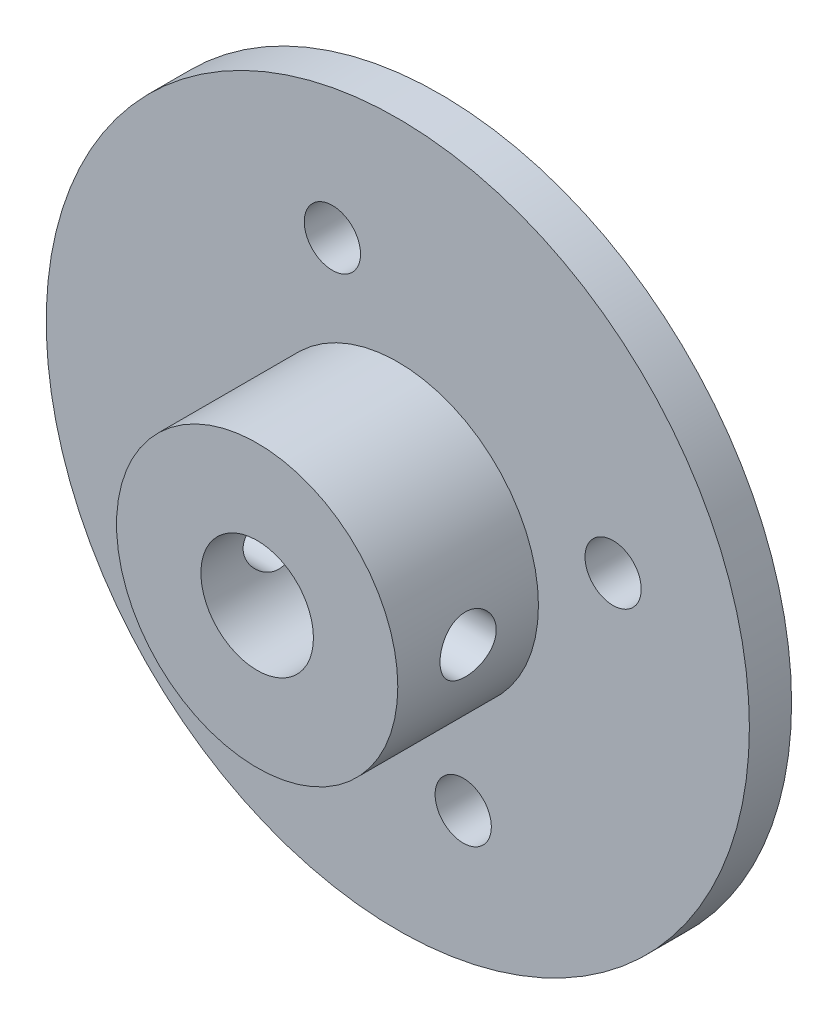
ISO-10303-21;
HEADER;
FILE_DESCRIPTION(('STEP AP214'),'2;1');
FILE_NAME('part.step','',(''),(''),'','','');
FILE_SCHEMA(('AUTOMOTIVE_DESIGN { 1 0 10303 214 1 1 1 1 }'));
ENDSEC;
DATA;
#1=APPLICATION_CONTEXT('core data for automotive mechanical design processes');
#2=APPLICATION_PROTOCOL_DEFINITION('international standard','automotive_design',2000,#1);
#3=PRODUCT_CONTEXT('',#1,'mechanical');
#4=PRODUCT('Part','Part','',(#3));
#5=PRODUCT_RELATED_PRODUCT_CATEGORY('part','',(#4));
#6=PRODUCT_DEFINITION_FORMATION('','',#4);
#7=PRODUCT_DEFINITION_CONTEXT('part definition',#1,'design');
#8=PRODUCT_DEFINITION('design','',#6,#7);
#9=PRODUCT_DEFINITION_SHAPE('','',#8);
#10=(LENGTH_UNIT() NAMED_UNIT(*) SI_UNIT(.MILLI.,.METRE.));
#11=(NAMED_UNIT(*) PLANE_ANGLE_UNIT() SI_UNIT($,.RADIAN.));
#12=(NAMED_UNIT(*) SI_UNIT($,.STERADIAN.) SOLID_ANGLE_UNIT());
#13=UNCERTAINTY_MEASURE_WITH_UNIT(LENGTH_MEASURE(1.E-05),#10,'distance_accuracy_value','');
#14=(GEOMETRIC_REPRESENTATION_CONTEXT(3) GLOBAL_UNCERTAINTY_ASSIGNED_CONTEXT((#13)) GLOBAL_UNIT_ASSIGNED_CONTEXT((#10,
#11,#12)) REPRESENTATION_CONTEXT('',''));
#15=CARTESIAN_POINT('',(0.,0.,0.));
#16=DIRECTION('',(0.,0.,1.));
#17=DIRECTION('',(1.,0.,0.));
#18=AXIS2_PLACEMENT_3D('',#15,#16,#17);
#19=CARTESIAN_POINT('',(0.,0.,3.));
#20=DIRECTION('',(0.,0.,-1.));
#21=DIRECTION('',(-1.,0.,0.));
#22=AXIS2_PLACEMENT_3D('',#19,#20,#21);
#23=CYLINDRICAL_SURFACE('',#22,25.);
#24=CARTESIAN_POINT('',(0.,0.,3.));
#25=DIRECTION('',(0.,0.,1.));
#26=DIRECTION('',(1.,0.,0.));
#27=AXIS2_PLACEMENT_3D('',#24,#25,#26);
#28=CIRCLE('',#27,25.);
#29=CARTESIAN_POINT('',(25.,0.,3.));
#30=VERTEX_POINT('',#29);
#31=EDGE_CURVE('E52',#30,#30,#28,.T.);
#32=ORIENTED_EDGE('',*,*,#31,.F.);
#33=EDGE_LOOP('',(#32));
#34=FACE_BOUND('',#33,.T.);
#35=CARTESIAN_POINT('',(0.,0.,0.));
#36=DIRECTION('',(0.,0.,1.));
#37=DIRECTION('',(1.,0.,0.));
#38=AXIS2_PLACEMENT_3D('',#35,#36,#37);
#39=CIRCLE('',#38,25.);
#40=CARTESIAN_POINT('',(25.,0.,0.));
#41=VERTEX_POINT('',#40);
#42=EDGE_CURVE('E58',#41,#41,#39,.T.);
#43=ORIENTED_EDGE('',*,*,#42,.T.);
#44=EDGE_LOOP('',(#43));
#45=FACE_BOUND('',#44,.T.);
#46=ADVANCED_FACE('F39',(#34,#45),#23,.T.);
#47=CARTESIAN_POINT('',(0.,0.,3.));
#48=DIRECTION('',(0.,0.,1.));
#49=DIRECTION('',(1.,0.,0.));
#50=AXIS2_PLACEMENT_3D('',#47,#48,#49);
#51=PLANE('',#50);
#52=CARTESIAN_POINT('',(-4.65167860969372,15.3088825886189,3.));
#53=DIRECTION('',(0.,0.,1.));
#54=DIRECTION('',(1.,0.,0.));
#55=AXIS2_PLACEMENT_3D('',#52,#53,#54);
#56=CIRCLE('',#55,2.);
#57=CARTESIAN_POINT('',(-2.65167860969372,15.3088825886189,3.));
#58=VERTEX_POINT('',#57);
#59=EDGE_CURVE('E278',#58,#58,#56,.T.);
#60=ORIENTED_EDGE('',*,*,#59,.F.);
#61=EDGE_LOOP('',(#60));
#62=FACE_BOUND('',#61,.T.);
#63=CARTESIAN_POINT('',(15.3088825886189,4.65167860969372,3.));
#64=DIRECTION('',(0.,0.,1.));
#65=DIRECTION('',(1.,0.,0.));
#66=AXIS2_PLACEMENT_3D('',#63,#64,#65);
#67=CIRCLE('',#66,2.);
#68=CARTESIAN_POINT('',(17.3088825886189,4.65167860969372,3.));
#69=VERTEX_POINT('',#68);
#70=EDGE_CURVE('E274',#69,#69,#67,.T.);
#71=ORIENTED_EDGE('',*,*,#70,.F.);
#72=EDGE_LOOP('',(#71));
#73=FACE_BOUND('',#72,.T.);
#74=CARTESIAN_POINT('',(4.65167860969373,-15.3088825886189,3.));
#75=DIRECTION('',(0.,0.,1.));
#76=DIRECTION('',(1.,0.,0.));
#77=AXIS2_PLACEMENT_3D('',#74,#75,#76);
#78=CIRCLE('',#77,2.);
#79=CARTESIAN_POINT('',(6.65167860969373,-15.3088825886189,3.));
#80=VERTEX_POINT('',#79);
#81=EDGE_CURVE('E266',#80,#80,#78,.T.);
#82=ORIENTED_EDGE('',*,*,#81,.F.);
#83=EDGE_LOOP('',(#82));
#84=FACE_BOUND('',#83,.T.);
#85=CARTESIAN_POINT('',(-15.3088825886189,-4.65167860969372,3.));
#86=DIRECTION('',(0.,0.,1.));
#87=DIRECTION('',(1.,0.,0.));
#88=AXIS2_PLACEMENT_3D('',#85,#86,#87);
#89=CIRCLE('',#88,2.);
#90=CARTESIAN_POINT('',(-13.3088825886189,-4.65167860969372,3.));
#91=VERTEX_POINT('',#90);
#92=EDGE_CURVE('E258',#91,#91,#89,.T.);
#93=ORIENTED_EDGE('',*,*,#92,.F.);
#94=EDGE_LOOP('',(#93));
#95=FACE_BOUND('',#94,.T.);
#96=CARTESIAN_POINT('',(0.,0.,3.));
#97=DIRECTION('',(0.,0.,1.));
#98=DIRECTION('',(1.,0.,0.));
#99=AXIS2_PLACEMENT_3D('',#96,#97,#98);
#100=CIRCLE('',#99,10.);
#101=CARTESIAN_POINT('',(10.,0.,3.));
#102=VERTEX_POINT('',#101);
#103=EDGE_CURVE('E10',#102,#102,#100,.T.);
#104=ORIENTED_EDGE('',*,*,#103,.F.);
#105=EDGE_LOOP('',(#104));
#106=FACE_BOUND('',#105,.T.);
#107=ORIENTED_EDGE('',*,*,#31,.T.);
#108=EDGE_LOOP('',(#107));
#109=FACE_BOUND('',#108,.T.);
#110=ADVANCED_FACE('F108',(#62,#73,#84,#95,#106,#109),#51,.T.);
#111=CARTESIAN_POINT('',(0.,0.,0.));
#112=DIRECTION('',(0.,0.,1.));
#113=DIRECTION('',(1.,0.,0.));
#114=AXIS2_PLACEMENT_3D('',#111,#112,#113);
#115=PLANE('',#114);
#116=CARTESIAN_POINT('',(-4.65167860969372,15.3088825886189,0.));
#117=DIRECTION('',(0.,0.,1.));
#118=DIRECTION('',(1.,0.,0.));
#119=AXIS2_PLACEMENT_3D('',#116,#117,#118);
#120=CIRCLE('',#119,2.);
#121=CARTESIAN_POINT('',(-2.65167860969372,15.3088825886189,0.));
#122=VERTEX_POINT('',#121);
#123=EDGE_CURVE('E252',#122,#122,#120,.T.);
#124=ORIENTED_EDGE('',*,*,#123,.T.);
#125=EDGE_LOOP('',(#124));
#126=FACE_BOUND('',#125,.T.);
#127=CARTESIAN_POINT('',(15.3088825886189,4.65167860969372,0.));
#128=DIRECTION('',(0.,0.,1.));
#129=DIRECTION('',(1.,0.,0.));
#130=AXIS2_PLACEMENT_3D('',#127,#128,#129);
#131=CIRCLE('',#130,2.);
#132=CARTESIAN_POINT('',(17.3088825886189,4.65167860969372,0.));
#133=VERTEX_POINT('',#132);
#134=EDGE_CURVE('E270',#133,#133,#131,.T.);
#135=ORIENTED_EDGE('',*,*,#134,.T.);
#136=EDGE_LOOP('',(#135));
#137=FACE_BOUND('',#136,.T.);
#138=CARTESIAN_POINT('',(4.65167860969373,-15.3088825886189,0.));
#139=DIRECTION('',(0.,0.,1.));
#140=DIRECTION('',(1.,0.,0.));
#141=AXIS2_PLACEMENT_3D('',#138,#139,#140);
#142=CIRCLE('',#141,2.);
#143=CARTESIAN_POINT('',(6.65167860969373,-15.3088825886189,0.));
#144=VERTEX_POINT('',#143);
#145=EDGE_CURVE('E262',#144,#144,#142,.T.);
#146=ORIENTED_EDGE('',*,*,#145,.T.);
#147=EDGE_LOOP('',(#146));
#148=FACE_BOUND('',#147,.T.);
#149=CARTESIAN_POINT('',(-15.3088825886189,-4.65167860969372,0.));
#150=DIRECTION('',(0.,0.,1.));
#151=DIRECTION('',(1.,0.,0.));
#152=AXIS2_PLACEMENT_3D('',#149,#150,#151);
#153=CIRCLE('',#152,2.);
#154=CARTESIAN_POINT('',(-13.3088825886189,-4.65167860969372,0.));
#155=VERTEX_POINT('',#154);
#156=EDGE_CURVE('E254',#155,#155,#153,.T.);
#157=ORIENTED_EDGE('',*,*,#156,.T.);
#158=EDGE_LOOP('',(#157));
#159=FACE_BOUND('',#158,.T.);
#160=CARTESIAN_POINT('',(0.,0.,0.));
#161=DIRECTION('',(0.,0.,1.));
#162=DIRECTION('',(1.,0.,0.));
#163=AXIS2_PLACEMENT_3D('',#160,#161,#162);
#164=CIRCLE('',#163,4.);
#165=CARTESIAN_POINT('',(4.,0.,0.));
#166=VERTEX_POINT('',#165);
#167=EDGE_CURVE('E245',#166,#166,#164,.T.);
#168=ORIENTED_EDGE('',*,*,#167,.T.);
#169=EDGE_LOOP('',(#168));
#170=FACE_BOUND('',#169,.T.);
#171=ORIENTED_EDGE('',*,*,#42,.F.);
#172=EDGE_LOOP('',(#171));
#173=FACE_BOUND('',#172,.T.);
#174=ADVANCED_FACE('F106',(#126,#137,#148,#159,#170,#173),#115,.F.);
#175=CARTESIAN_POINT('',(0.,0.,13.));
#176=DIRECTION('',(0.,0.,-1.));
#177=DIRECTION('',(-1.,0.,0.));
#178=AXIS2_PLACEMENT_3D('',#175,#176,#177);
#179=CYLINDRICAL_SURFACE('',#178,10.);
#180=CARTESIAN_POINT('',(-10.,0.,10.));
#181=CARTESIAN_POINT('',(-9.99999795161742,-0.111153813585266,9.99999591100331));
#182=CARTESIAN_POINT('',(-9.99812770356462,-0.222359320403045,9.99070231406471));
#183=CARTESIAN_POINT('',(-9.99084731246463,-0.441627015378039,9.95380299976951));
#184=CARTESIAN_POINT('',(-9.98543435720372,-0.549686635082712,9.92618273439698));
#185=CARTESIAN_POINT('',(-9.97167298556573,-0.759460610526626,9.85351745275842));
#186=CARTESIAN_POINT('',(-9.96332738153436,-0.861180935866268,9.80848912631062));
#187=CARTESIAN_POINT('',(-9.94460796070629,-1.05561597772845,9.70233550497741));
#188=CARTESIAN_POINT('',(-9.93423426471414,-1.14833123015162,9.64121116878559));
#189=CARTESIAN_POINT('',(-9.9124433065994,-1.32338695462973,9.50372301141713));
#190=CARTESIAN_POINT('',(-9.90101491008695,-1.40558790231705,9.4271832892176));
#191=CARTESIAN_POINT('',(-9.87848360905177,-1.55607351321606,9.2614151672166));
#192=CARTESIAN_POINT('',(-9.86738073000848,-1.62435708954085,9.17218577732976));
#193=CARTESIAN_POINT('',(-9.8466488362523,-1.74566350669524,8.98256761397625));
#194=CARTESIAN_POINT('',(-9.83703414729892,-1.79854187773173,8.88208471240728));
#195=CARTESIAN_POINT('',(-9.82052536116836,-1.88661133316062,8.67343636199184));
#196=CARTESIAN_POINT('',(-9.81363099523923,-1.92180416487448,8.56527167330731));
#197=CARTESIAN_POINT('',(-9.80345610504409,-1.97305059976965,8.34583127218416));
#198=CARTESIAN_POINT('',(-9.80012940214375,-1.98934899591755,8.23461491171555));
#199=CARTESIAN_POINT('',(-9.79732750121254,-2.00310425545224,8.01098035727131));
#200=CARTESIAN_POINT('',(-9.79785190935681,-2.000563045427,7.89856228735971));
#201=CARTESIAN_POINT('',(-9.80265102296369,-1.97690914620364,7.67750642395799));
#202=CARTESIAN_POINT('',(-9.80686905717527,-1.95607708048781,7.56883718874537));
#203=CARTESIAN_POINT('',(-9.81849092320002,-1.8968757692461,7.356567846674));
#204=CARTESIAN_POINT('',(-9.82589490715558,-1.85850568620136,7.25296798216198));
#205=CARTESIAN_POINT('',(-9.84311237000816,-1.76504956734944,7.0529694765928));
#206=CARTESIAN_POINT('',(-9.85294179627409,-1.70985230246423,6.95662424086166));
#207=CARTESIAN_POINT('',(-9.87389237546124,-1.58438714914536,6.77445830005437));
#208=CARTESIAN_POINT('',(-9.88501367676732,-1.51411752871366,6.68863880629769));
#209=CARTESIAN_POINT('',(-9.90754042482924,-1.35899986912117,6.52834119508613));
#210=CARTESIAN_POINT('',(-9.9189473842181,-1.27391232242489,6.45409486428174));
#211=CARTESIAN_POINT('',(-9.94057697428817,-1.09237004812402,6.32089230739755));
#212=CARTESIAN_POINT('',(-9.95079958977947,-0.995915174758778,6.26193627741284));
#213=CARTESIAN_POINT('',(-9.96893380321774,-0.794118773757842,6.16094498154805));
#214=CARTESIAN_POINT('',(-9.97684177696544,-0.688763639170601,6.11893621271093));
#215=CARTESIAN_POINT('',(-9.98942817975716,-0.47229795289733,6.05327905192287));
#216=CARTESIAN_POINT('',(-9.99410700001063,-0.3611881001449,6.02962843585274));
#217=CARTESIAN_POINT('',(-9.99965343733735,-0.138358811254301,6.00168709241145));
#218=CARTESIAN_POINT('',(-10.0005834930494,-0.0266806566511528,5.99707916091946));
#219=CARTESIAN_POINT('',(-9.99870103860205,0.195849868385428,6.00649971788436));
#220=CARTESIAN_POINT('',(-9.99588873882892,0.306702284887586,6.02052715870519));
#221=CARTESIAN_POINT('',(-9.98687664016035,0.523411319893081,6.06655674708791));
#222=CARTESIAN_POINT('',(-9.98070752808413,0.629303896679806,6.09839613699581));
#223=CARTESIAN_POINT('',(-9.96567104122065,0.834247254999334,6.17896796531162));
#224=CARTESIAN_POINT('',(-9.95680346428454,0.933297523275079,6.22770166935366));
#225=CARTESIAN_POINT('',(-9.93719823066589,1.12308234737243,6.34136498130263));
#226=CARTESIAN_POINT('',(-9.92643900874104,1.21370025350438,6.40648556207789));
#227=CARTESIAN_POINT('',(-9.90429469659765,1.38283603823841,6.55081838241456));
#228=CARTESIAN_POINT('',(-9.89290953936776,1.46135261786152,6.63003213279973));
#229=CARTESIAN_POINT('',(-9.8705860711393,1.60528118154835,6.80174670378225));
#230=CARTESIAN_POINT('',(-9.85965720466609,1.67047540489731,6.89443148844267));
#231=CARTESIAN_POINT('',(-9.83968383592389,1.78437084010241,7.08962272271336));
#232=CARTESIAN_POINT('',(-9.83063925826685,1.83307271184581,7.19212877914711));
#233=CARTESIAN_POINT('',(-9.81553481168766,1.91230368316392,7.4035364922991));
#234=CARTESIAN_POINT('',(-9.80945949744373,1.9429269995821,7.51240168242064));
#235=CARTESIAN_POINT('',(-9.8009487358405,1.98541730325439,7.73386690698181));
#236=CARTESIAN_POINT('',(-9.79851281382223,1.99728673645023,7.84646645241869));
#237=CARTESIAN_POINT('',(-9.79758299262758,2.00184182173494,8.07001772908864));
#238=CARTESIAN_POINT('',(-9.79901838378602,1.99487157614179,8.18096229785402));
#239=CARTESIAN_POINT('',(-9.80551146969228,1.96270460820012,8.40006329981005));
#240=CARTESIAN_POINT('',(-9.81056913534338,1.9375080322586,8.50821975538961));
#241=CARTESIAN_POINT('',(-9.82370528438317,1.86975713699791,8.71845542248109));
#242=CARTESIAN_POINT('',(-9.83177642037661,1.82724501343469,8.82054872100483));
#243=CARTESIAN_POINT('',(-9.85003429948341,1.72610928920321,9.01620744146888));
#244=CARTESIAN_POINT('',(-9.86022121997788,1.66748433754977,9.10977214745027));
#245=CARTESIAN_POINT('',(-9.88177921046451,1.53461182957283,9.28743114430063));
#246=CARTESIAN_POINT('',(-9.89316745819399,1.46011577447036,9.37133753053519));
#247=CARTESIAN_POINT('',(-9.91572163743909,1.29812873802628,9.52557241105834));
#248=CARTESIAN_POINT('',(-9.92688751726369,1.21063477430667,9.59589778063454));
#249=CARTESIAN_POINT('',(-9.94787664775943,1.02403525817649,9.72166928789289));
#250=CARTESIAN_POINT('',(-9.95768462438492,0.92481776885967,9.77695200656005));
#251=CARTESIAN_POINT('',(-9.9747025017,0.718332721881466,9.86997224519318));
#252=CARTESIAN_POINT('',(-9.98191474277232,0.611072521726253,9.90772557906498));
#253=CARTESIAN_POINT('',(-9.99152745190741,0.419642977847559,9.95730389608943));
#254=CARTESIAN_POINT('',(-9.99468606316904,0.336563328027569,9.97328638741552));
#255=CARTESIAN_POINT('',(-9.99892308279786,0.168999050420134,9.99463582471673));
#256=CARTESIAN_POINT('',(-10.0000015574631,0.0845144674972381,10.0000031090195));
#257=CARTESIAN_POINT('',(-10.,0.,10.));
#258=B_SPLINE_CURVE_WITH_KNOTS('',3,(#180,#181,#182,#183,#184,#185,#186,#187,#188,#189,#190,
#191,#192,#193,#194,#195,#196,#197,#198,#199,#200,#201,#202,#203,#204,#205,#206,#207,#208,#209,
#210,#211,#212,#213,#214,#215,#216,#217,#218,#219,#220,#221,#222,#223,#224,#225,#226,#227,#228,
#229,#230,#231,#232,#233,#234,#235,#236,#237,#238,#239,#240,#241,#242,#243,#244,#245,#246,#247,
#248,#249,#250,#251,#252,#253,#254,#255,#256,#257),.UNSPECIFIED.,.T.,.F.,(4,2,2,2,2,2,2,2,2,2,2,
2,2,2,2,2,2,2,2,2,2,2,2,2,2,2,2,2,2,2,2,2,2,2,2,2,2,2,4),(0.,0.333152261322517,
0.666569301382646,0.999667470500683,1.33274580446173,1.66986534022437,2.00701119349473,
2.34722390011845,2.68740298730395,3.02312370207175,3.3588100856245,3.68943454012557,
4.02007478507459,4.35294980407185,4.68586309499341,5.02476504982701,5.36367135079641,
5.70310549708048,6.04249851396072,6.3762147135253,6.70991215315735,7.04060907901447,
7.37133078432045,7.70610132066717,8.0409077669186,8.38081257158452,8.72070377446933,
9.05880762065446,9.3968673666083,9.72879445135403,10.0607188698522,10.3918392250622,
10.7229873516373,11.0597615247829,11.3966130906586,11.7369899335127,12.0770591103504,
12.3303755057979,12.5836838274199),.UNSPECIFIED.);
#259=CARTESIAN_POINT('',(-10.,0.,10.));
#260=VERTEX_POINT('',#259);
#261=EDGE_CURVE('E96',#260,#260,#258,.T.);
#262=ORIENTED_EDGE('',*,*,#261,.T.);
#263=EDGE_LOOP('',(#262));
#264=FACE_BOUND('',#263,.T.);
#265=CARTESIAN_POINT('',(10.,0.,6.));
#266=CARTESIAN_POINT('',(9.99999795161742,-0.111153813585266,6.00000408899669));
#267=CARTESIAN_POINT('',(9.99812770356462,-0.222359320403045,6.00929768593529));
#268=CARTESIAN_POINT('',(9.99084731246463,-0.441627015378039,6.04619700023049));
#269=CARTESIAN_POINT('',(9.98543435720372,-0.549686635082712,6.07381726560302));
#270=CARTESIAN_POINT('',(9.97167298556573,-0.759460610526626,6.14648254724158));
#271=CARTESIAN_POINT('',(9.96332738153436,-0.861180935866269,6.19151087368938));
#272=CARTESIAN_POINT('',(9.94460796070629,-1.05561597772845,6.29766449502259));
#273=CARTESIAN_POINT('',(9.93423426471414,-1.14833123015162,6.35878883121441));
#274=CARTESIAN_POINT('',(9.9124433065994,-1.32338695462973,6.49627698858287));
#275=CARTESIAN_POINT('',(9.90101491008695,-1.40558790231705,6.5728167107824));
#276=CARTESIAN_POINT('',(9.87848360905177,-1.55607351321606,6.73858483278341));
#277=CARTESIAN_POINT('',(9.86738073000847,-1.62435708954085,6.82781422267024));
#278=CARTESIAN_POINT('',(9.8466488362523,-1.74566350669524,7.01743238602375));
#279=CARTESIAN_POINT('',(9.83703414729892,-1.79854187773173,7.11791528759272));
#280=CARTESIAN_POINT('',(9.82052536116836,-1.88661133316062,7.32656363800816));
#281=CARTESIAN_POINT('',(9.81363099523923,-1.92180416487448,7.43472832669269));
#282=CARTESIAN_POINT('',(9.80345610504409,-1.97305059976966,7.65416872781584));
#283=CARTESIAN_POINT('',(9.80012940214375,-1.98934899591755,7.76538508828445));
#284=CARTESIAN_POINT('',(9.79732750121254,-2.00310425545224,7.98901964272869));
#285=CARTESIAN_POINT('',(9.79785190935681,-2.000563045427,8.10143771264029));
#286=CARTESIAN_POINT('',(9.80265102296369,-1.97690914620364,8.32249357604201));
#287=CARTESIAN_POINT('',(9.80686905717527,-1.95607708048781,8.43116281125463));
#288=CARTESIAN_POINT('',(9.81849092320002,-1.8968757692461,8.64343215332601));
#289=CARTESIAN_POINT('',(9.82589490715558,-1.85850568620136,8.74703201783802));
#290=CARTESIAN_POINT('',(9.84311237000816,-1.76504956734944,8.9470305234072));
#291=CARTESIAN_POINT('',(9.85294179627409,-1.70985230246423,9.04337575913834));
#292=CARTESIAN_POINT('',(9.87389237546124,-1.58438714914536,9.22554169994563));
#293=CARTESIAN_POINT('',(9.88501367676732,-1.51411752871366,9.31136119370231));
#294=CARTESIAN_POINT('',(9.90754042482924,-1.35899986912117,9.47165880491387));
#295=CARTESIAN_POINT('',(9.9189473842181,-1.27391232242489,9.54590513571826));
#296=CARTESIAN_POINT('',(9.94057697428817,-1.09237004812402,9.67910769260245));
#297=CARTESIAN_POINT('',(9.95079958977947,-0.995915174758778,9.73806372258716));
#298=CARTESIAN_POINT('',(9.96893380321774,-0.794118773757841,9.83905501845195));
#299=CARTESIAN_POINT('',(9.97684177696544,-0.6887636391706,9.88106378728907));
#300=CARTESIAN_POINT('',(9.98942817975716,-0.472297952897329,9.94672094807713));
#301=CARTESIAN_POINT('',(9.99410700001063,-0.361188100144898,9.97037156414726));
#302=CARTESIAN_POINT('',(9.99965343733736,-0.1383588112543,9.99831290758856));
#303=CARTESIAN_POINT('',(10.0005834930494,-0.0266806566511518,10.0029208390805));
#304=CARTESIAN_POINT('',(9.99870103860205,0.195849868385429,9.99350028211564));
#305=CARTESIAN_POINT('',(9.99588873882892,0.306702284887587,9.97947284129481));
#306=CARTESIAN_POINT('',(9.98687664016035,0.523411319893082,9.93344325291209));
#307=CARTESIAN_POINT('',(9.98070752808413,0.629303896679806,9.90160386300419));
#308=CARTESIAN_POINT('',(9.96567104122065,0.834247254999335,9.82103203468838));
#309=CARTESIAN_POINT('',(9.95680346428453,0.933297523275079,9.77229833064634));
#310=CARTESIAN_POINT('',(9.93719823066589,1.12308234737244,9.65863501869738));
#311=CARTESIAN_POINT('',(9.92643900874103,1.21370025350438,9.59351443792211));
#312=CARTESIAN_POINT('',(9.90429469659765,1.38283603823841,9.44918161758544));
#313=CARTESIAN_POINT('',(9.89290953936776,1.46135261786153,9.36996786720027));
#314=CARTESIAN_POINT('',(9.8705860711393,1.60528118154835,9.19825329621775));
#315=CARTESIAN_POINT('',(9.85965720466609,1.67047540489731,9.10556851155732));
#316=CARTESIAN_POINT('',(9.83968383592389,1.78437084010241,8.91037727728664));
#317=CARTESIAN_POINT('',(9.83063925826685,1.83307271184581,8.8078712208529));
#318=CARTESIAN_POINT('',(9.81553481168766,1.91230368316392,8.5964635077009));
#319=CARTESIAN_POINT('',(9.80945949744373,1.9429269995821,8.48759831757936));
#320=CARTESIAN_POINT('',(9.8009487358405,1.98541730325439,8.26613309301819));
#321=CARTESIAN_POINT('',(9.79851281382223,1.99728673645023,8.1535335475813));
#322=CARTESIAN_POINT('',(9.79758299262758,2.00184182173494,7.92998227091136));
#323=CARTESIAN_POINT('',(9.79901838378602,1.99487157614179,7.81903770214598));
#324=CARTESIAN_POINT('',(9.80551146969228,1.96270460820012,7.59993670018995));
#325=CARTESIAN_POINT('',(9.81056913534338,1.9375080322586,7.49178024461039));
#326=CARTESIAN_POINT('',(9.82370528438317,1.86975713699791,7.28154457751891));
#327=CARTESIAN_POINT('',(9.83177642037661,1.82724501343469,7.17945127899517));
#328=CARTESIAN_POINT('',(9.85003429948341,1.72610928920321,6.98379255853112));
#329=CARTESIAN_POINT('',(9.86022121997788,1.66748433754976,6.89022785254972));
#330=CARTESIAN_POINT('',(9.88177921046451,1.53461182957283,6.71256885569937));
#331=CARTESIAN_POINT('',(9.89316745819399,1.46011577447036,6.62866246946481));
#332=CARTESIAN_POINT('',(9.91572163743909,1.29812873802628,6.47442758894166));
#333=CARTESIAN_POINT('',(9.92688751726369,1.21063477430667,6.40410221936546));
#334=CARTESIAN_POINT('',(9.94787664775943,1.02403525817649,6.27833071210711));
#335=CARTESIAN_POINT('',(9.95768462438492,0.924817768859669,6.22304799343995));
#336=CARTESIAN_POINT('',(9.9747025017,0.718332721881465,6.13002775480682));
#337=CARTESIAN_POINT('',(9.98191474277232,0.611072521726252,6.09227442093502));
#338=CARTESIAN_POINT('',(9.99152745190741,0.419642977847558,6.04269610391057));
#339=CARTESIAN_POINT('',(9.99468606316904,0.336563328027569,6.02671361258448));
#340=CARTESIAN_POINT('',(9.99892308279786,0.168999050420134,6.00536417528327));
#341=CARTESIAN_POINT('',(10.0000015574631,0.084514467497238,5.99999689098046));
#342=CARTESIAN_POINT('',(10.,0.,6.));
#343=B_SPLINE_CURVE_WITH_KNOTS('',3,(#265,#266,#267,#268,#269,#270,#271,#272,#273,#274,#275,
#276,#277,#278,#279,#280,#281,#282,#283,#284,#285,#286,#287,#288,#289,#290,#291,#292,#293,#294,
#295,#296,#297,#298,#299,#300,#301,#302,#303,#304,#305,#306,#307,#308,#309,#310,#311,#312,#313,
#314,#315,#316,#317,#318,#319,#320,#321,#322,#323,#324,#325,#326,#327,#328,#329,#330,#331,#332,
#333,#334,#335,#336,#337,#338,#339,#340,#341,#342),.UNSPECIFIED.,.T.,.F.,(4,2,2,2,2,2,2,2,2,2,2,
2,2,2,2,2,2,2,2,2,2,2,2,2,2,2,2,2,2,2,2,2,2,2,2,2,2,2,4),(0.,0.333152261322517,
0.666569301382646,0.999667470500684,1.33274580446173,1.66986534022437,2.00701119349473,
2.34722390011846,2.68740298730395,3.02312370207175,3.3588100856245,3.68943454012557,
4.02007478507459,4.35294980407185,4.68586309499341,5.02476504982701,5.36367135079641,
5.70310549708048,6.04249851396072,6.3762147135253,6.70991215315735,7.04060907901447,
7.37133078432045,7.70610132066717,8.0409077669186,8.38081257158452,8.72070377446933,
9.05880762065446,9.3968673666083,9.72879445135403,10.0607188698522,10.3918392250622,
10.7229873516373,11.0597615247829,11.3966130906586,11.7369899335127,12.0770591103504,
12.3303755057979,12.5836838274199),.UNSPECIFIED.);
#344=CARTESIAN_POINT('',(10.,0.,6.));
#345=VERTEX_POINT('',#344);
#346=EDGE_CURVE('E89',#345,#345,#343,.T.);
#347=ORIENTED_EDGE('',*,*,#346,.T.);
#348=EDGE_LOOP('',(#347));
#349=FACE_BOUND('',#348,.T.);
#350=CARTESIAN_POINT('',(0.,0.,13.));
#351=DIRECTION('',(0.,0.,1.));
#352=DIRECTION('',(1.,0.,0.));
#353=AXIS2_PLACEMENT_3D('',#350,#351,#352);
#354=CIRCLE('',#353,10.);
#355=CARTESIAN_POINT('',(10.,0.,13.));
#356=VERTEX_POINT('',#355);
#357=EDGE_CURVE('E61',#356,#356,#354,.T.);
#358=ORIENTED_EDGE('',*,*,#357,.F.);
#359=EDGE_LOOP('',(#358));
#360=FACE_BOUND('',#359,.T.);
#361=ORIENTED_EDGE('',*,*,#103,.T.);
#362=EDGE_LOOP('',(#361));
#363=FACE_BOUND('',#362,.T.);
#364=ADVANCED_FACE('F101',(#264,#349,#360,#363),#179,.T.);
#365=CARTESIAN_POINT('',(0.,0.,13.));
#366=DIRECTION('',(0.,0.,1.));
#367=DIRECTION('',(1.,0.,0.));
#368=AXIS2_PLACEMENT_3D('',#365,#366,#367);
#369=PLANE('',#368);
#370=CARTESIAN_POINT('',(0.,0.,13.));
#371=DIRECTION('',(0.,0.,1.));
#372=DIRECTION('',(1.,0.,0.));
#373=AXIS2_PLACEMENT_3D('',#370,#371,#372);
#374=CIRCLE('',#373,4.);
#375=CARTESIAN_POINT('',(4.,0.,13.));
#376=VERTEX_POINT('',#375);
#377=EDGE_CURVE('E240',#376,#376,#374,.T.);
#378=ORIENTED_EDGE('',*,*,#377,.F.);
#379=EDGE_LOOP('',(#378));
#380=FACE_BOUND('',#379,.T.);
#381=ORIENTED_EDGE('',*,*,#357,.T.);
#382=EDGE_LOOP('',(#381));
#383=FACE_BOUND('',#382,.T.);
#384=ADVANCED_FACE('F105',(#380,#383),#369,.T.);
#385=CARTESIAN_POINT('',(0.,0.,0.));
#386=DIRECTION('',(0.,0.,1.));
#387=DIRECTION('',(1.,0.,0.));
#388=AXIS2_PLACEMENT_3D('',#385,#386,#387);
#389=CYLINDRICAL_SURFACE('',#388,4.);
#390=CARTESIAN_POINT('',(4.,0.,6.));
#391=CARTESIAN_POINT('',(3.99999426810082,0.105143925902467,6.00000660463438));
#392=CARTESIAN_POINT('',(3.99580982039513,0.210413199395125,6.00834014624211));
#393=CARTESIAN_POINT('',(3.97948312074314,0.417840470537792,6.04130576068308));
#394=CARTESIAN_POINT('',(3.96732575657839,0.519992173427259,6.06596878599563));
#395=CARTESIAN_POINT('',(3.93632558806751,0.717867089760898,6.13038761723326));
#396=CARTESIAN_POINT('',(3.91750878355075,0.813613605878293,6.17008476849594));
#397=CARTESIAN_POINT('',(3.87491553031523,0.996945233613197,6.26314124272997));
#398=CARTESIAN_POINT('',(3.85113947267051,1.08453098798012,6.31649948849773));
#399=CARTESIAN_POINT('',(3.79912516516124,1.25501563552382,6.43903449897057));
#400=CARTESIAN_POINT('',(3.77070398255074,1.33731042224422,6.50897295847928));
#401=CARTESIAN_POINT('',(3.71319940493486,1.48955888973396,6.66104295849407));
#402=CARTESIAN_POINT('',(3.68411552418069,1.55950316621353,6.74318370354488));
#403=CARTESIAN_POINT('',(3.62597902394695,1.69050400090056,6.92496669904676));
#404=CARTESIAN_POINT('',(3.59710373940264,1.75045067110327,7.02547219669183));
#405=CARTESIAN_POINT('',(3.54571957544641,1.85233645378139,7.23673467197243));
#406=CARTESIAN_POINT('',(3.52320615213979,1.89428842993267,7.3474842574455));
#407=CARTESIAN_POINT('',(3.48915734075617,1.95626488437718,7.56933021084385));
#408=CARTESIAN_POINT('',(3.47704543167427,1.97745171416088,7.68000890413479));
#409=CARTESIAN_POINT('',(3.46363779897055,2.00085398661769,7.90395767555895));
#410=CARTESIAN_POINT('',(3.46233138686576,2.00308817674615,8.01722508174231));
#411=CARTESIAN_POINT('',(3.47021860514497,1.98937457434459,8.22857204863074));
#412=CARTESIAN_POINT('',(3.47817527324027,1.97556911907364,8.3268480624461));
#413=CARTESIAN_POINT('',(3.50152457467701,1.93387969811387,8.51944381874609));
#414=CARTESIAN_POINT('',(3.51691957663553,1.9059912477953,8.61376229061063));
#415=CARTESIAN_POINT('',(3.55374952825482,1.83641956077201,8.79845826513132));
#416=CARTESIAN_POINT('',(3.57531681327997,1.79443013423199,8.88869279757158));
#417=CARTESIAN_POINT('',(3.62206808562807,1.698083375336,9.06126858518002));
#418=CARTESIAN_POINT('',(3.64725369560381,1.64372048762493,9.14360627120018));
#419=CARTESIAN_POINT('',(3.70226315806572,1.51613210982558,9.30904250548645));
#420=CARTESIAN_POINT('',(3.73227020473492,1.44138891673856,9.39091374715232));
#421=CARTESIAN_POINT('',(3.79095246600814,1.27911115748275,9.54147083718181));
#422=CARTESIAN_POINT('',(3.81962703917602,1.19157051314857,9.61015038406777));
#423=CARTESIAN_POINT('',(3.87403974565928,1.0010330116637,9.73537132205946));
#424=CARTESIAN_POINT('',(3.89957968324014,0.897507183198818,9.79120094489148));
#425=CARTESIAN_POINT('',(3.94315762242485,0.680932430977593,9.88419405808602));
#426=CARTESIAN_POINT('',(3.96120157887106,0.567891152530551,9.92137237003033));
#427=CARTESIAN_POINT('',(3.98648667482871,0.345532983321404,9.97295080743335));
#428=CARTESIAN_POINT('',(3.9944987660262,0.236683061096652,9.98898247149356));
#429=CARTESIAN_POINT('',(4.00146026918207,0.0175591998987035,10.002929462269));
#430=CARTESIAN_POINT('',(4.00041397442637,-0.0927140397398172,10.0008533712789));
#431=CARTESIAN_POINT('',(3.9898238450687,-0.302465943971974,9.97958662316251));
#432=CARTESIAN_POINT('',(3.98094491376337,-0.40211881609986,9.96173493454001));
#433=CARTESIAN_POINT('',(3.9564434262968,-0.596813784603882,9.91152385620976));
#434=CARTESIAN_POINT('',(3.94082012668824,-0.691855371382173,9.87916286709301));
#435=CARTESIAN_POINT('',(3.90368502827176,-0.877777216899145,9.80000306713393));
#436=CARTESIAN_POINT('',(3.88201763539261,-0.968460794011607,9.75281789976743));
#437=CARTESIAN_POINT('',(3.83487948634835,-1.14092272339854,9.64578492870687));
#438=CARTESIAN_POINT('',(3.80940711133877,-1.22269725955318,9.58593173080921));
#439=CARTESIAN_POINT('',(3.75416442672396,-1.38353537857843,9.44847914933857));
#440=CARTESIAN_POINT('',(3.72421769686998,-1.46154415563805,9.36971426310971));
#441=CARTESIAN_POINT('',(3.6652478321764,-1.60371264223771,9.20014969744455));
#442=CARTESIAN_POINT('',(3.63622534800094,-1.66786277142375,9.10934176230416));
#443=CARTESIAN_POINT('',(3.58102384412979,-1.78341582895804,8.91271269165405));
#444=CARTESIAN_POINT('',(3.55505059178121,-1.8340509916005,8.80637746781104));
#445=CARTESIAN_POINT('',(3.51148144588269,-1.91616565186941,8.58497986485007));
#446=CARTESIAN_POINT('',(3.493874764435,-1.94766983173403,8.46992894706622));
#447=CARTESIAN_POINT('',(3.47123002051604,-1.98772337493374,8.24617955423059));
#448=CARTESIAN_POINT('',(3.4651476693013,-1.9981859928109,8.13793149312952));
#449=CARTESIAN_POINT('',(3.46330709283206,-2.0013783087524,7.92110586567095));
#450=CARTESIAN_POINT('',(3.4675443925278,-1.99411569324648,7.81252846252428));
#451=CARTESIAN_POINT('',(3.48475724102153,-1.96385225118662,7.60903299693313));
#452=CARTESIAN_POINT('',(3.49686188965317,-1.94241662868607,7.51379905971052));
#453=CARTESIAN_POINT('',(3.52742032375305,-1.88635071644882,7.32838376115127));
#454=CARTESIAN_POINT('',(3.54587615139337,-1.85171618231984,7.23820403581594));
#455=CARTESIAN_POINT('',(3.58857060729071,-1.76763149060113,7.05875029802693));
#456=CARTESIAN_POINT('',(3.61311444791841,-1.7173422756314,6.96994419634195));
#457=CARTESIAN_POINT('',(3.66470663269721,-1.60430194327479,6.80145092763749));
#458=CARTESIAN_POINT('',(3.69175627591221,-1.54154434248312,6.72176853895778));
#459=CARTESIAN_POINT('',(3.74924646316184,-1.39640665332275,6.56371603529065));
#460=CARTESIAN_POINT('',(3.77969966613256,-1.31256884599452,6.48668179529942));
#461=CARTESIAN_POINT('',(3.83755504519861,-1.1323096124664,6.34747403312946));
#462=CARTESIAN_POINT('',(3.8649555725239,-1.0358814466104,6.28530852106019));
#463=CARTESIAN_POINT('',(3.91396019133075,-0.831863193565892,6.17752727457586));
#464=CARTESIAN_POINT('',(3.93552192987866,-0.724199007553461,6.13203166152707));
#465=CARTESIAN_POINT('',(3.97002682597974,-0.501484202276173,6.06038366448518));
#466=CARTESIAN_POINT('',(3.98299446726136,-0.3864555991782,6.03417630638857));
#467=CARTESIAN_POINT('',(3.99390923826956,-0.225203892981791,6.01220517782852));
#468=CARTESIAN_POINT('',(3.99618730680502,-0.18032375888313,6.00763471826732));
#469=CARTESIAN_POINT('',(3.99923393953631,-0.0903034636101834,6.00153066897183));
#470=CARTESIAN_POINT('',(4.00000246206762,-0.045163295293257,5.99999716305958));
#471=CARTESIAN_POINT('',(4.,0.,6.));
#472=B_SPLINE_CURVE_WITH_KNOTS('',3,(#390,#391,#392,#393,#394,#395,#396,#397,#398,#399,#400,
#401,#402,#403,#404,#405,#406,#407,#408,#409,#410,#411,#412,#413,#414,#415,#416,#417,#418,#419,
#420,#421,#422,#423,#424,#425,#426,#427,#428,#429,#430,#431,#432,#433,#434,#435,#436,#437,#438,
#439,#440,#441,#442,#443,#444,#445,#446,#447,#448,#449,#450,#451,#452,#453,#454,#455,#456,#457,
#458,#459,#460,#461,#462,#463,#464,#465,#466,#467,#468,#469,#470,#471),.UNSPECIFIED.,.T.,.F.,(4,
2,2,2,2,2,2,2,2,2,2,2,2,2,2,2,2,2,2,2,2,2,2,2,2,2,2,2,2,2,2,2,2,2,2,2,2,2,2,2,4),(0.,
0.315248514840585,0.631096299418395,0.945724310984597,1.26032752116314,1.59396351743618,
1.92785247530807,2.28763452861505,2.64715895796562,2.98516024280459,3.32282714658041,
3.62011424818641,3.91749607851357,4.22180480336975,4.52625042520444,4.86929882667757,
5.21251069197373,5.57166044428881,5.93052433824559,6.25966580942691,6.58865129022952,
6.89213813012244,7.19565843261863,7.50785712055797,7.82018901496678,8.16319221288838,
8.50643177230864,8.86629364323452,9.22569023890902,9.55058615006093,9.87534119729357,
10.1691586049771,10.463070575767,10.7767291356057,11.0905512228726,11.4425048551434,
11.7946476676249,12.1492802732705,12.502898172423,12.6383056026783,12.7737167702213),.UNSPECIFIED.);
#473=CARTESIAN_POINT('',(4.,0.,6.));
#474=VERTEX_POINT('',#473);
#475=EDGE_CURVE('E42',#474,#474,#472,.T.);
#476=ORIENTED_EDGE('',*,*,#475,.T.);
#477=EDGE_LOOP('',(#476));
#478=FACE_BOUND('',#477,.T.);
#479=CARTESIAN_POINT('',(-4.,0.,6.));
#480=CARTESIAN_POINT('',(-3.99999426810082,-0.105143925902467,6.00000660463438));
#481=CARTESIAN_POINT('',(-3.99580982039513,-0.210413199395125,6.00834014624211));
#482=CARTESIAN_POINT('',(-3.97948312074314,-0.417840470537792,6.04130576068308));
#483=CARTESIAN_POINT('',(-3.96732575657839,-0.519992173427259,6.06596878599563));
#484=CARTESIAN_POINT('',(-3.93632558806751,-0.717867089760898,6.13038761723326));
#485=CARTESIAN_POINT('',(-3.91750878355075,-0.813613605878293,6.17008476849594));
#486=CARTESIAN_POINT('',(-3.87491553031523,-0.996945233613197,6.26314124272997));
#487=CARTESIAN_POINT('',(-3.85113947267051,-1.08453098798012,6.31649948849773));
#488=CARTESIAN_POINT('',(-3.79912516516124,-1.25501563552382,6.43903449897057));
#489=CARTESIAN_POINT('',(-3.77070398255074,-1.33731042224422,6.50897295847928));
#490=CARTESIAN_POINT('',(-3.71319940493486,-1.48955888973396,6.66104295849407));
#491=CARTESIAN_POINT('',(-3.68411552418069,-1.55950316621353,6.74318370354488));
#492=CARTESIAN_POINT('',(-3.62597902394695,-1.69050400090056,6.92496669904676));
#493=CARTESIAN_POINT('',(-3.59710373940264,-1.75045067110327,7.02547219669183));
#494=CARTESIAN_POINT('',(-3.54571957544641,-1.85233645378139,7.23673467197243));
#495=CARTESIAN_POINT('',(-3.52320615213979,-1.89428842993267,7.3474842574455));
#496=CARTESIAN_POINT('',(-3.48915734075617,-1.95626488437718,7.56933021084385));
#497=CARTESIAN_POINT('',(-3.47704543167427,-1.97745171416088,7.68000890413479));
#498=CARTESIAN_POINT('',(-3.46363779897055,-2.00085398661769,7.90395767555895));
#499=CARTESIAN_POINT('',(-3.46233138686576,-2.00308817674615,8.01722508174231));
#500=CARTESIAN_POINT('',(-3.47021860514497,-1.98937457434459,8.22857204863074));
#501=CARTESIAN_POINT('',(-3.47817527324027,-1.97556911907364,8.3268480624461));
#502=CARTESIAN_POINT('',(-3.50152457467701,-1.93387969811387,8.51944381874609));
#503=CARTESIAN_POINT('',(-3.51691957663553,-1.9059912477953,8.61376229061063));
#504=CARTESIAN_POINT('',(-3.55374952825482,-1.83641956077201,8.79845826513132));
#505=CARTESIAN_POINT('',(-3.57531681327997,-1.79443013423199,8.88869279757158));
#506=CARTESIAN_POINT('',(-3.62206808562807,-1.698083375336,9.06126858518002));
#507=CARTESIAN_POINT('',(-3.64725369560381,-1.64372048762493,9.14360627120018));
#508=CARTESIAN_POINT('',(-3.70226315806572,-1.51613210982558,9.30904250548645));
#509=CARTESIAN_POINT('',(-3.73227020473492,-1.44138891673856,9.39091374715232));
#510=CARTESIAN_POINT('',(-3.79095246600814,-1.27911115748275,9.54147083718181));
#511=CARTESIAN_POINT('',(-3.81962703917602,-1.19157051314857,9.61015038406777));
#512=CARTESIAN_POINT('',(-3.87403974565928,-1.0010330116637,9.73537132205946));
#513=CARTESIAN_POINT('',(-3.89957968324014,-0.897507183198818,9.79120094489148));
#514=CARTESIAN_POINT('',(-3.94315762242485,-0.680932430977593,9.88419405808602));
#515=CARTESIAN_POINT('',(-3.96120157887106,-0.567891152530551,9.92137237003033));
#516=CARTESIAN_POINT('',(-3.98648667482871,-0.345532983321404,9.97295080743335));
#517=CARTESIAN_POINT('',(-3.9944987660262,-0.236683061096652,9.98898247149356));
#518=CARTESIAN_POINT('',(-4.00146026918207,-0.0175591998987035,10.002929462269));
#519=CARTESIAN_POINT('',(-4.00041397442637,0.0927140397398172,10.0008533712789));
#520=CARTESIAN_POINT('',(-3.9898238450687,0.302465943971974,9.97958662316251));
#521=CARTESIAN_POINT('',(-3.98094491376337,0.40211881609986,9.96173493454001));
#522=CARTESIAN_POINT('',(-3.9564434262968,0.596813784603882,9.91152385620976));
#523=CARTESIAN_POINT('',(-3.94082012668824,0.691855371382173,9.87916286709301));
#524=CARTESIAN_POINT('',(-3.90368502827176,0.877777216899145,9.80000306713393));
#525=CARTESIAN_POINT('',(-3.88201763539261,0.968460794011607,9.75281789976743));
#526=CARTESIAN_POINT('',(-3.83487948634835,1.14092272339854,9.64578492870687));
#527=CARTESIAN_POINT('',(-3.80940711133877,1.22269725955318,9.58593173080921));
#528=CARTESIAN_POINT('',(-3.75416442672396,1.38353537857843,9.44847914933857));
#529=CARTESIAN_POINT('',(-3.72421769686998,1.46154415563805,9.36971426310971));
#530=CARTESIAN_POINT('',(-3.6652478321764,1.60371264223771,9.20014969744455));
#531=CARTESIAN_POINT('',(-3.63622534800094,1.66786277142375,9.10934176230416));
#532=CARTESIAN_POINT('',(-3.58102384412979,1.78341582895804,8.91271269165405));
#533=CARTESIAN_POINT('',(-3.55505059178121,1.8340509916005,8.80637746781104));
#534=CARTESIAN_POINT('',(-3.51148144588269,1.91616565186941,8.58497986485007));
#535=CARTESIAN_POINT('',(-3.493874764435,1.94766983173403,8.46992894706622));
#536=CARTESIAN_POINT('',(-3.47123002051604,1.98772337493374,8.24617955423059));
#537=CARTESIAN_POINT('',(-3.4651476693013,1.9981859928109,8.13793149312952));
#538=CARTESIAN_POINT('',(-3.46330709283206,2.0013783087524,7.92110586567095));
#539=CARTESIAN_POINT('',(-3.4675443925278,1.99411569324648,7.81252846252428));
#540=CARTESIAN_POINT('',(-3.48475724102153,1.96385225118662,7.60903299693313));
#541=CARTESIAN_POINT('',(-3.49686188965317,1.94241662868607,7.51379905971052));
#542=CARTESIAN_POINT('',(-3.52742032375305,1.88635071644882,7.32838376115127));
#543=CARTESIAN_POINT('',(-3.54587615139337,1.85171618231984,7.23820403581594));
#544=CARTESIAN_POINT('',(-3.58857060729071,1.76763149060113,7.05875029802693));
#545=CARTESIAN_POINT('',(-3.61311444791841,1.7173422756314,6.96994419634195));
#546=CARTESIAN_POINT('',(-3.66470663269721,1.60430194327479,6.80145092763749));
#547=CARTESIAN_POINT('',(-3.69175627591221,1.54154434248312,6.72176853895778));
#548=CARTESIAN_POINT('',(-3.74924646316184,1.39640665332275,6.56371603529065));
#549=CARTESIAN_POINT('',(-3.77969966613256,1.31256884599452,6.48668179529942));
#550=CARTESIAN_POINT('',(-3.83755504519861,1.1323096124664,6.34747403312946));
#551=CARTESIAN_POINT('',(-3.8649555725239,1.0358814466104,6.28530852106019));
#552=CARTESIAN_POINT('',(-3.91396019133075,0.831863193565892,6.17752727457586));
#553=CARTESIAN_POINT('',(-3.93552192987866,0.724199007553461,6.13203166152707));
#554=CARTESIAN_POINT('',(-3.97002682597974,0.501484202276173,6.06038366448518));
#555=CARTESIAN_POINT('',(-3.98299446726136,0.3864555991782,6.03417630638857));
#556=CARTESIAN_POINT('',(-3.99390923826956,0.225203892981791,6.01220517782852));
#557=CARTESIAN_POINT('',(-3.99618730680502,0.18032375888313,6.00763471826732));
#558=CARTESIAN_POINT('',(-3.99923393953631,0.0903034636101834,6.00153066897183));
#559=CARTESIAN_POINT('',(-4.00000246206762,0.045163295293257,5.99999716305958));
#560=CARTESIAN_POINT('',(-4.,0.,6.));
#561=B_SPLINE_CURVE_WITH_KNOTS('',3,(#479,#480,#481,#482,#483,#484,#485,#486,#487,#488,#489,
#490,#491,#492,#493,#494,#495,#496,#497,#498,#499,#500,#501,#502,#503,#504,#505,#506,#507,#508,
#509,#510,#511,#512,#513,#514,#515,#516,#517,#518,#519,#520,#521,#522,#523,#524,#525,#526,#527,
#528,#529,#530,#531,#532,#533,#534,#535,#536,#537,#538,#539,#540,#541,#542,#543,#544,#545,#546,
#547,#548,#549,#550,#551,#552,#553,#554,#555,#556,#557,#558,#559,#560),.UNSPECIFIED.,.T.,.F.,(4,
2,2,2,2,2,2,2,2,2,2,2,2,2,2,2,2,2,2,2,2,2,2,2,2,2,2,2,2,2,2,2,2,2,2,2,2,2,2,2,4),(0.,
0.315248514840585,0.631096299418395,0.945724310984597,1.26032752116314,1.59396351743618,
1.92785247530807,2.28763452861505,2.64715895796562,2.98516024280459,3.32282714658041,
3.62011424818641,3.91749607851357,4.22180480336975,4.52625042520444,4.86929882667757,
5.21251069197373,5.57166044428881,5.93052433824559,6.25966580942691,6.58865129022952,
6.89213813012244,7.19565843261863,7.50785712055797,7.82018901496678,8.16319221288838,
8.50643177230864,8.86629364323452,9.22569023890902,9.55058615006093,9.87534119729357,
10.1691586049771,10.463070575767,10.7767291356057,11.0905512228726,11.4425048551434,
11.7946476676249,12.1492802732705,12.502898172423,12.6383056026783,12.7737167702213),.UNSPECIFIED.);
#562=CARTESIAN_POINT('',(-4.,0.,6.));
#563=VERTEX_POINT('',#562);
#564=EDGE_CURVE('E66',#563,#563,#561,.T.);
#565=ORIENTED_EDGE('',*,*,#564,.T.);
#566=EDGE_LOOP('',(#565));
#567=FACE_BOUND('',#566,.T.);
#568=ORIENTED_EDGE('',*,*,#167,.F.);
#569=EDGE_LOOP('',(#568));
#570=FACE_BOUND('',#569,.T.);
#571=ORIENTED_EDGE('',*,*,#377,.T.);
#572=EDGE_LOOP('',(#571));
#573=FACE_BOUND('',#572,.T.);
#574=ADVANCED_FACE('F72',(#478,#567,#570,#573),#389,.F.);
#575=CARTESIAN_POINT('',(-15.3088825886189,-4.65167860969372,0.));
#576=DIRECTION('',(0.,0.,1.));
#577=DIRECTION('',(1.,0.,0.));
#578=AXIS2_PLACEMENT_3D('',#575,#576,#577);
#579=CYLINDRICAL_SURFACE('',#578,2.);
#580=ORIENTED_EDGE('',*,*,#156,.F.);
#581=EDGE_LOOP('',(#580));
#582=FACE_BOUND('',#581,.T.);
#583=ORIENTED_EDGE('',*,*,#92,.T.);
#584=EDGE_LOOP('',(#583));
#585=FACE_BOUND('',#584,.T.);
#586=ADVANCED_FACE('F147',(#582,#585),#579,.F.);
#587=CARTESIAN_POINT('',(4.65167860969373,-15.3088825886189,0.));
#588=DIRECTION('',(0.,0.,1.));
#589=DIRECTION('',(1.,0.,0.));
#590=AXIS2_PLACEMENT_3D('',#587,#588,#589);
#591=CYLINDRICAL_SURFACE('',#590,2.);
#592=ORIENTED_EDGE('',*,*,#145,.F.);
#593=EDGE_LOOP('',(#592));
#594=FACE_BOUND('',#593,.T.);
#595=ORIENTED_EDGE('',*,*,#81,.T.);
#596=EDGE_LOOP('',(#595));
#597=FACE_BOUND('',#596,.T.);
#598=ADVANCED_FACE('F152',(#594,#597),#591,.F.);
#599=CARTESIAN_POINT('',(15.3088825886189,4.65167860969372,0.));
#600=DIRECTION('',(0.,0.,1.));
#601=DIRECTION('',(1.,0.,0.));
#602=AXIS2_PLACEMENT_3D('',#599,#600,#601);
#603=CYLINDRICAL_SURFACE('',#602,2.);
#604=ORIENTED_EDGE('',*,*,#134,.F.);
#605=EDGE_LOOP('',(#604));
#606=FACE_BOUND('',#605,.T.);
#607=ORIENTED_EDGE('',*,*,#70,.T.);
#608=EDGE_LOOP('',(#607));
#609=FACE_BOUND('',#608,.T.);
#610=ADVANCED_FACE('F164',(#606,#609),#603,.F.);
#611=CARTESIAN_POINT('',(-4.65167860969372,15.3088825886189,0.));
#612=DIRECTION('',(0.,0.,1.));
#613=DIRECTION('',(1.,0.,0.));
#614=AXIS2_PLACEMENT_3D('',#611,#612,#613);
#615=CYLINDRICAL_SURFACE('',#614,2.);
#616=ORIENTED_EDGE('',*,*,#123,.F.);
#617=EDGE_LOOP('',(#616));
#618=FACE_BOUND('',#617,.T.);
#619=ORIENTED_EDGE('',*,*,#59,.T.);
#620=EDGE_LOOP('',(#619));
#621=FACE_BOUND('',#620,.T.);
#622=ADVANCED_FACE('F81',(#618,#621),#615,.F.);
#623=CARTESIAN_POINT('',(-25.,0.,8.));
#624=DIRECTION('',(1.,0.,0.));
#625=DIRECTION('',(0.,0.,-1.));
#626=AXIS2_PLACEMENT_3D('',#623,#624,#625);
#627=CYLINDRICAL_SURFACE('',#626,2.);
#628=ORIENTED_EDGE('',*,*,#564,.F.);
#629=EDGE_LOOP('',(#628));
#630=FACE_BOUND('',#629,.T.);
#631=ORIENTED_EDGE('',*,*,#261,.F.);
#632=EDGE_LOOP('',(#631));
#633=FACE_BOUND('',#632,.T.);
#634=ADVANCED_FACE('F76',(#630,#633),#627,.F.);
#635=ORIENTED_EDGE('',*,*,#475,.F.);
#636=EDGE_LOOP('',(#635));
#637=FACE_BOUND('',#636,.T.);
#638=ORIENTED_EDGE('',*,*,#346,.F.);
#639=EDGE_LOOP('',(#638));
#640=FACE_BOUND('',#639,.T.);
#641=ADVANCED_FACE('F80',(#637,#640),#627,.F.);
#642=CLOSED_SHELL('',(#46,#110,#174,#364,#384,#574,#586,#598,#610,#622,#634,#641));
#643=MANIFOLD_SOLID_BREP('B2',#642);
#644=ADVANCED_BREP_SHAPE_REPRESENTATION('',(#18,#643),#14);
#645=SHAPE_DEFINITION_REPRESENTATION(#9,#644);
ENDSEC;
END-ISO-10303-21;
